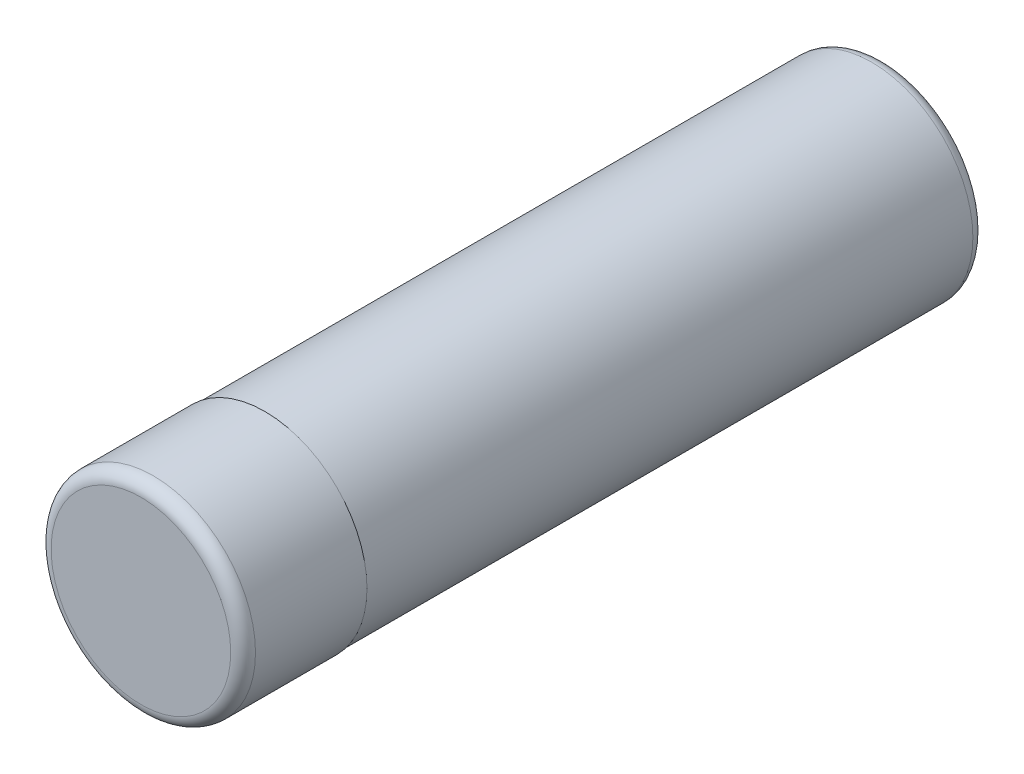
ISO-10303-21;
HEADER;
FILE_DESCRIPTION(('STEP AP214'),'2;1');
FILE_NAME('part.step','',(''),(''),'','','');
FILE_SCHEMA(('AUTOMOTIVE_DESIGN { 1 0 10303 214 1 1 1 1 }'));
ENDSEC;
DATA;
#1=APPLICATION_CONTEXT('core data for automotive mechanical design processes');
#2=APPLICATION_PROTOCOL_DEFINITION('international standard','automotive_design',2000,#1);
#3=PRODUCT_CONTEXT('',#1,'mechanical');
#4=PRODUCT('Part','Part','',(#3));
#5=PRODUCT_RELATED_PRODUCT_CATEGORY('part','',(#4));
#6=PRODUCT_DEFINITION_FORMATION('','',#4);
#7=PRODUCT_DEFINITION_CONTEXT('part definition',#1,'design');
#8=PRODUCT_DEFINITION('design','',#6,#7);
#9=PRODUCT_DEFINITION_SHAPE('','',#8);
#10=(LENGTH_UNIT() NAMED_UNIT(*) SI_UNIT(.MILLI.,.METRE.));
#11=(NAMED_UNIT(*) PLANE_ANGLE_UNIT() SI_UNIT($,.RADIAN.));
#12=(NAMED_UNIT(*) SI_UNIT($,.STERADIAN.) SOLID_ANGLE_UNIT());
#13=UNCERTAINTY_MEASURE_WITH_UNIT(LENGTH_MEASURE(1.E-05),#10,'distance_accuracy_value','');
#14=(GEOMETRIC_REPRESENTATION_CONTEXT(3) GLOBAL_UNCERTAINTY_ASSIGNED_CONTEXT((#13)) GLOBAL_UNIT_ASSIGNED_CONTEXT((#10,
#11,#12)) REPRESENTATION_CONTEXT('',''));
#15=CARTESIAN_POINT('',(0.,0.,0.));
#16=DIRECTION('',(0.,0.,1.));
#17=DIRECTION('',(1.,0.,0.));
#18=AXIS2_PLACEMENT_3D('',#15,#16,#17);
#19=CARTESIAN_POINT('',(0.,0.,15.));
#20=DIRECTION('',(0.,0.,-1.));
#21=DIRECTION('',(-1.,0.,0.));
#22=AXIS2_PLACEMENT_3D('',#19,#20,#21);
#23=CYLINDRICAL_SURFACE('',#22,2.45);
#24=CARTESIAN_POINT('',(0.,0.,0.3));
#25=DIRECTION('',(0.,0.,1.));
#26=DIRECTION('',(1.,0.,0.));
#27=AXIS2_PLACEMENT_3D('',#24,#25,#26);
#28=CIRCLE('',#27,2.45);
#29=CARTESIAN_POINT('',(2.45,0.,0.3));
#30=VERTEX_POINT('',#29);
#31=EDGE_CURVE('E37',#30,#30,#28,.T.);
#32=ORIENTED_EDGE('',*,*,#31,.T.);
#33=EDGE_LOOP('',(#32));
#34=FACE_BOUND('',#33,.T.);
#35=CARTESIAN_POINT('',(0.,0.,15.));
#36=DIRECTION('',(0.,0.,1.));
#37=DIRECTION('',(1.,0.,0.));
#38=AXIS2_PLACEMENT_3D('',#35,#36,#37);
#39=CIRCLE('',#38,2.45);
#40=CARTESIAN_POINT('',(2.45,0.,15.));
#41=VERTEX_POINT('',#40);
#42=EDGE_CURVE('E50',#41,#41,#39,.T.);
#43=ORIENTED_EDGE('',*,*,#42,.F.);
#44=EDGE_LOOP('',(#43));
#45=FACE_BOUND('',#44,.T.);
#46=ADVANCED_FACE('F30',(#34,#45),#23,.T.);
#47=CARTESIAN_POINT('',(0.,0.,0.));
#48=DIRECTION('',(0.,0.,1.));
#49=DIRECTION('',(1.,0.,0.));
#50=AXIS2_PLACEMENT_3D('',#47,#48,#49);
#51=PLANE('',#50);
#52=CARTESIAN_POINT('',(0.,0.,0.));
#53=DIRECTION('',(0.,0.,1.));
#54=DIRECTION('',(1.,0.,0.));
#55=AXIS2_PLACEMENT_3D('',#52,#53,#54);
#56=CIRCLE('',#55,2.15);
#57=CARTESIAN_POINT('',(2.15,0.,0.));
#58=VERTEX_POINT('',#57);
#59=EDGE_CURVE('E10',#58,#58,#56,.F.);
#60=ORIENTED_EDGE('',*,*,#59,.T.);
#61=EDGE_LOOP('',(#60));
#62=FACE_BOUND('',#61,.T.);
#63=ADVANCED_FACE('F74',(#62),#51,.F.);
#64=CARTESIAN_POINT('',(0.,0.,18.));
#65=DIRECTION('',(0.,0.,-1.));
#66=DIRECTION('',(-1.,0.,0.));
#67=AXIS2_PLACEMENT_3D('',#64,#65,#66);
#68=CYLINDRICAL_SURFACE('',#67,2.475);
#69=CARTESIAN_POINT('',(0.,0.,17.7));
#70=DIRECTION('',(0.,0.,1.));
#71=DIRECTION('',(1.,0.,0.));
#72=AXIS2_PLACEMENT_3D('',#69,#70,#71);
#73=CIRCLE('',#72,2.475);
#74=CARTESIAN_POINT('',(2.475,0.,17.7));
#75=VERTEX_POINT('',#74);
#76=EDGE_CURVE('E41',#75,#75,#73,.F.);
#77=ORIENTED_EDGE('',*,*,#76,.T.);
#78=EDGE_LOOP('',(#77));
#79=FACE_BOUND('',#78,.T.);
#80=CARTESIAN_POINT('',(0.,0.,15.));
#81=DIRECTION('',(0.,0.,1.));
#82=DIRECTION('',(1.,0.,0.));
#83=AXIS2_PLACEMENT_3D('',#80,#81,#82);
#84=CIRCLE('',#83,2.475);
#85=CARTESIAN_POINT('',(2.475,0.,15.));
#86=VERTEX_POINT('',#85);
#87=EDGE_CURVE('E53',#86,#86,#84,.T.);
#88=ORIENTED_EDGE('',*,*,#87,.T.);
#89=EDGE_LOOP('',(#88));
#90=FACE_BOUND('',#89,.T.);
#91=ADVANCED_FACE('F57',(#79,#90),#68,.T.);
#92=CARTESIAN_POINT('',(0.,0.,18.));
#93=DIRECTION('',(0.,0.,1.));
#94=DIRECTION('',(1.,0.,0.));
#95=AXIS2_PLACEMENT_3D('',#92,#93,#94);
#96=PLANE('',#95);
#97=CARTESIAN_POINT('',(0.,0.,18.));
#98=DIRECTION('',(0.,0.,1.));
#99=DIRECTION('',(1.,0.,0.));
#100=AXIS2_PLACEMENT_3D('',#97,#98,#99);
#101=CIRCLE('',#100,2.175);
#102=CARTESIAN_POINT('',(2.175,0.,18.));
#103=VERTEX_POINT('',#102);
#104=EDGE_CURVE('E45',#103,#103,#101,.T.);
#105=ORIENTED_EDGE('',*,*,#104,.T.);
#106=EDGE_LOOP('',(#105));
#107=FACE_BOUND('',#106,.T.);
#108=ADVANCED_FACE('F62',(#107),#96,.T.);
#109=CARTESIAN_POINT('',(0.,0.,15.));
#110=DIRECTION('',(0.,0.,1.));
#111=DIRECTION('',(1.,0.,0.));
#112=AXIS2_PLACEMENT_3D('',#109,#110,#111);
#113=PLANE('',#112);
#114=ORIENTED_EDGE('',*,*,#42,.T.);
#115=EDGE_LOOP('',(#114));
#116=FACE_BOUND('',#115,.T.);
#117=ORIENTED_EDGE('',*,*,#87,.F.);
#118=EDGE_LOOP('',(#117));
#119=FACE_BOUND('',#118,.T.);
#120=ADVANCED_FACE('F59',(#116,#119),#113,.F.);
#121=CARTESIAN_POINT('',(0.,0.,17.7));
#122=DIRECTION('',(0.,0.,1.));
#123=DIRECTION('',(1.,0.,0.));
#124=AXIS2_PLACEMENT_3D('',#121,#122,#123);
#125=TOROIDAL_SURFACE('',#124,2.175,0.3);
#126=ORIENTED_EDGE('',*,*,#76,.F.);
#127=EDGE_LOOP('',(#126));
#128=FACE_BOUND('',#127,.T.);
#129=ORIENTED_EDGE('',*,*,#104,.F.);
#130=EDGE_LOOP('',(#129));
#131=FACE_BOUND('',#130,.T.);
#132=ADVANCED_FACE('F61',(#128,#131),#125,.T.);
#133=CARTESIAN_POINT('',(0.,0.,0.3));
#134=DIRECTION('',(0.,0.,1.));
#135=DIRECTION('',(1.,0.,0.));
#136=AXIS2_PLACEMENT_3D('',#133,#134,#135);
#137=TOROIDAL_SURFACE('',#136,2.15,0.3);
#138=ORIENTED_EDGE('',*,*,#59,.F.);
#139=EDGE_LOOP('',(#138));
#140=FACE_BOUND('',#139,.T.);
#141=ORIENTED_EDGE('',*,*,#31,.F.);
#142=EDGE_LOOP('',(#141));
#143=FACE_BOUND('',#142,.T.);
#144=ADVANCED_FACE('F32',(#140,#143),#137,.T.);
#145=CLOSED_SHELL('',(#46,#63,#91,#108,#120,#132,#144));
#146=MANIFOLD_SOLID_BREP('B2',#145);
#147=ADVANCED_BREP_SHAPE_REPRESENTATION('',(#18,#146),#14);
#148=SHAPE_DEFINITION_REPRESENTATION(#9,#147);
ENDSEC;
END-ISO-10303-21;
